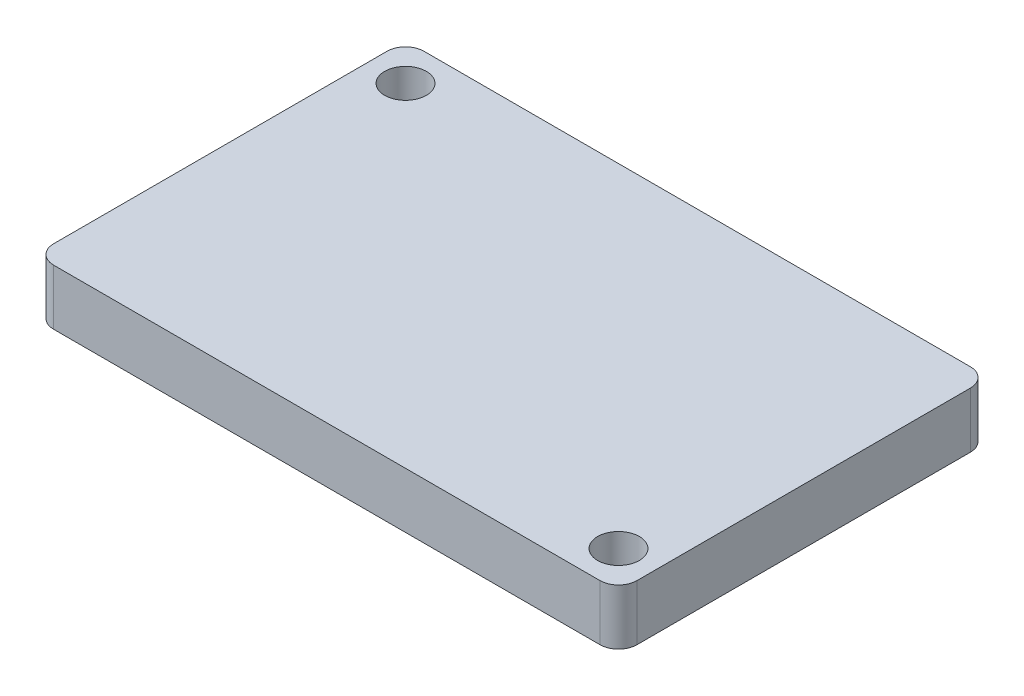
ISO-10303-21;
HEADER;
FILE_DESCRIPTION(('STEP AP214'),'2;1');
FILE_NAME('part.step','',(''),(''),'','','');
FILE_SCHEMA(('AUTOMOTIVE_DESIGN { 1 0 10303 214 1 1 1 1 }'));
ENDSEC;
DATA;
#1=APPLICATION_CONTEXT('core data for automotive mechanical design processes');
#2=APPLICATION_PROTOCOL_DEFINITION('international standard','automotive_design',2000,#1);
#3=PRODUCT_CONTEXT('',#1,'mechanical');
#4=PRODUCT('Part','Part','',(#3));
#5=PRODUCT_RELATED_PRODUCT_CATEGORY('part','',(#4));
#6=PRODUCT_DEFINITION_FORMATION('','',#4);
#7=PRODUCT_DEFINITION_CONTEXT('part definition',#1,'design');
#8=PRODUCT_DEFINITION('design','',#6,#7);
#9=PRODUCT_DEFINITION_SHAPE('','',#8);
#10=(LENGTH_UNIT() NAMED_UNIT(*) SI_UNIT(.MILLI.,.METRE.));
#11=(NAMED_UNIT(*) PLANE_ANGLE_UNIT() SI_UNIT($,.RADIAN.));
#12=(NAMED_UNIT(*) SI_UNIT($,.STERADIAN.) SOLID_ANGLE_UNIT());
#13=UNCERTAINTY_MEASURE_WITH_UNIT(LENGTH_MEASURE(1.E-05),#10,'distance_accuracy_value','');
#14=(GEOMETRIC_REPRESENTATION_CONTEXT(3) GLOBAL_UNCERTAINTY_ASSIGNED_CONTEXT((#13)) GLOBAL_UNIT_ASSIGNED_CONTEXT((#10,
#11,#12)) REPRESENTATION_CONTEXT('',''));
#15=CARTESIAN_POINT('',(0.,0.,0.));
#16=DIRECTION('',(0.,0.,1.));
#17=DIRECTION('',(1.,0.,0.));
#18=AXIS2_PLACEMENT_3D('',#15,#16,#17);
#19=CARTESIAN_POINT('',(0.,6.,40.));
#20=DIRECTION('',(1.,0.,0.));
#21=DIRECTION('',(0.,0.,-1.));
#22=AXIS2_PLACEMENT_3D('',#19,#20,#21);
#23=PLANE('',#22);
#24=DIRECTION('',(0.,0.,-1.));
#25=VECTOR('',#24,1.);
#26=CARTESIAN_POINT('',(0.,6.,40.));
#27=LINE('',#26,#25);
#28=CARTESIAN_POINT('',(0.,6.,38.));
#29=VERTEX_POINT('',#28);
#30=CARTESIAN_POINT('',(0.,6.,2.));
#31=VERTEX_POINT('',#30);
#32=EDGE_CURVE('E160',#29,#31,#27,.T.);
#33=ORIENTED_EDGE('',*,*,#32,.T.);
#34=DIRECTION('',(0.,-1.,0.));
#35=VECTOR('',#34,1.);
#36=CARTESIAN_POINT('',(0.,6.,2.));
#37=LINE('',#36,#35);
#38=CARTESIAN_POINT('',(0.,0.,2.));
#39=VERTEX_POINT('',#38);
#40=EDGE_CURVE('E124',#31,#39,#37,.T.);
#41=ORIENTED_EDGE('',*,*,#40,.T.);
#42=DIRECTION('',(0.,0.,-1.));
#43=VECTOR('',#42,1.);
#44=CARTESIAN_POINT('',(0.,0.,40.));
#45=LINE('',#44,#43);
#46=CARTESIAN_POINT('',(0.,0.,38.));
#47=VERTEX_POINT('',#46);
#48=EDGE_CURVE('E109',#47,#39,#45,.T.);
#49=ORIENTED_EDGE('',*,*,#48,.F.);
#50=DIRECTION('',(0.,-1.,0.));
#51=VECTOR('',#50,1.);
#52=CARTESIAN_POINT('',(0.,6.,38.));
#53=LINE('',#52,#51);
#54=EDGE_CURVE('E121',#47,#29,#53,.F.);
#55=ORIENTED_EDGE('',*,*,#54,.T.);
#56=EDGE_LOOP('',(#33,#41,#49,#55));
#57=FACE_BOUND('',#56,.T.);
#58=ADVANCED_FACE('F39',(#57),#23,.F.);
#59=CARTESIAN_POINT('',(0.,0.,40.));
#60=DIRECTION('',(0.,1.,0.));
#61=DIRECTION('',(0.,0.,1.));
#62=AXIS2_PLACEMENT_3D('',#59,#60,#61);
#63=PLANE('',#62);
#64=CARTESIAN_POINT('',(59.,0.,36.));
#65=DIRECTION('',(0.,1.,0.));
#66=DIRECTION('',(0.,0.,1.));
#67=AXIS2_PLACEMENT_3D('',#64,#65,#66);
#68=CIRCLE('',#67,2.25);
#69=CARTESIAN_POINT('',(59.,0.,38.25));
#70=VERTEX_POINT('',#69);
#71=EDGE_CURVE('E315',#70,#70,#68,.T.);
#72=ORIENTED_EDGE('',*,*,#71,.T.);
#73=EDGE_LOOP('',(#72));
#74=FACE_BOUND('',#73,.T.);
#75=CARTESIAN_POINT('',(4.,0.,4.));
#76=DIRECTION('',(0.,1.,0.));
#77=DIRECTION('',(0.,0.,1.));
#78=AXIS2_PLACEMENT_3D('',#75,#76,#77);
#79=CIRCLE('',#78,2.25);
#80=CARTESIAN_POINT('',(4.,0.,6.25));
#81=VERTEX_POINT('',#80);
#82=EDGE_CURVE('E171',#81,#81,#79,.T.);
#83=ORIENTED_EDGE('',*,*,#82,.T.);
#84=EDGE_LOOP('',(#83));
#85=FACE_BOUND('',#84,.T.);
#86=ORIENTED_EDGE('',*,*,#48,.T.);
#87=CARTESIAN_POINT('',(2.,0.,2.));
#88=DIRECTION('',(0.,1.,0.));
#89=DIRECTION('',(0.,0.,1.));
#90=AXIS2_PLACEMENT_3D('',#87,#88,#89);
#91=CIRCLE('',#90,2.);
#92=CARTESIAN_POINT('',(2.,0.,0.));
#93=VERTEX_POINT('',#92);
#94=EDGE_CURVE('E136',#39,#93,#91,.F.);
#95=ORIENTED_EDGE('',*,*,#94,.T.);
#96=DIRECTION('',(1.,0.,0.));
#97=VECTOR('',#96,1.);
#98=CARTESIAN_POINT('',(0.,0.,0.));
#99=LINE('',#98,#97);
#100=CARTESIAN_POINT('',(61.,0.,0.));
#101=VERTEX_POINT('',#100);
#102=EDGE_CURVE('E168',#93,#101,#99,.T.);
#103=ORIENTED_EDGE('',*,*,#102,.T.);
#104=CARTESIAN_POINT('',(61.,0.,2.));
#105=DIRECTION('',(0.,1.,0.));
#106=DIRECTION('',(0.,0.,1.));
#107=AXIS2_PLACEMENT_3D('',#104,#105,#106);
#108=CIRCLE('',#107,2.);
#109=CARTESIAN_POINT('',(63.,0.,2.));
#110=VERTEX_POINT('',#109);
#111=EDGE_CURVE('E115',#101,#110,#108,.F.);
#112=ORIENTED_EDGE('',*,*,#111,.T.);
#113=DIRECTION('',(0.,0.,-1.));
#114=VECTOR('',#113,1.);
#115=CARTESIAN_POINT('',(63.,0.,40.));
#116=LINE('',#115,#114);
#117=CARTESIAN_POINT('',(63.,0.,38.));
#118=VERTEX_POINT('',#117);
#119=EDGE_CURVE('E125',#118,#110,#116,.T.);
#120=ORIENTED_EDGE('',*,*,#119,.F.);
#121=CARTESIAN_POINT('',(61.,0.,38.));
#122=DIRECTION('',(0.,1.,0.));
#123=DIRECTION('',(0.,0.,1.));
#124=AXIS2_PLACEMENT_3D('',#121,#122,#123);
#125=CIRCLE('',#124,2.);
#126=CARTESIAN_POINT('',(61.,0.,40.));
#127=VERTEX_POINT('',#126);
#128=EDGE_CURVE('E116',#118,#127,#125,.F.);
#129=ORIENTED_EDGE('',*,*,#128,.T.);
#130=DIRECTION('',(1.,0.,0.));
#131=VECTOR('',#130,1.);
#132=CARTESIAN_POINT('',(0.,0.,40.));
#133=LINE('',#132,#131);
#134=CARTESIAN_POINT('',(2.,0.,40.));
#135=VERTEX_POINT('',#134);
#136=EDGE_CURVE('E111',#135,#127,#133,.T.);
#137=ORIENTED_EDGE('',*,*,#136,.F.);
#138=CARTESIAN_POINT('',(2.,0.,38.));
#139=DIRECTION('',(0.,1.,0.));
#140=DIRECTION('',(0.,0.,1.));
#141=AXIS2_PLACEMENT_3D('',#138,#139,#140);
#142=CIRCLE('',#141,2.);
#143=EDGE_CURVE('E106',#135,#47,#142,.F.);
#144=ORIENTED_EDGE('',*,*,#143,.T.);
#145=EDGE_LOOP('',(#86,#95,#103,#112,#120,#129,#137,#144));
#146=FACE_BOUND('',#145,.T.);
#147=ADVANCED_FACE('F108',(#74,#85,#146),#63,.F.);
#148=CARTESIAN_POINT('',(63.,0.,40.));
#149=DIRECTION('',(-1.,0.,0.));
#150=DIRECTION('',(0.,0.,1.));
#151=AXIS2_PLACEMENT_3D('',#148,#149,#150);
#152=PLANE('',#151);
#153=ORIENTED_EDGE('',*,*,#119,.T.);
#154=DIRECTION('',(0.,1.,0.));
#155=VECTOR('',#154,1.);
#156=CARTESIAN_POINT('',(63.,0.,2.));
#157=LINE('',#156,#155);
#158=CARTESIAN_POINT('',(63.,6.,2.));
#159=VERTEX_POINT('',#158);
#160=EDGE_CURVE('E149',#110,#159,#157,.T.);
#161=ORIENTED_EDGE('',*,*,#160,.T.);
#162=DIRECTION('',(0.,0.,-1.));
#163=VECTOR('',#162,1.);
#164=CARTESIAN_POINT('',(63.,6.,40.));
#165=LINE('',#164,#163);
#166=CARTESIAN_POINT('',(63.,6.,38.));
#167=VERTEX_POINT('',#166);
#168=EDGE_CURVE('E162',#167,#159,#165,.T.);
#169=ORIENTED_EDGE('',*,*,#168,.F.);
#170=DIRECTION('',(0.,1.,0.));
#171=VECTOR('',#170,1.);
#172=CARTESIAN_POINT('',(63.,0.,38.));
#173=LINE('',#172,#171);
#174=EDGE_CURVE('E147',#167,#118,#173,.F.);
#175=ORIENTED_EDGE('',*,*,#174,.T.);
#176=EDGE_LOOP('',(#153,#161,#169,#175));
#177=FACE_BOUND('',#176,.T.);
#178=ADVANCED_FACE('F176',(#177),#152,.F.);
#179=CARTESIAN_POINT('',(63.,6.,40.));
#180=DIRECTION('',(0.,-1.,0.));
#181=DIRECTION('',(0.,0.,-1.));
#182=AXIS2_PLACEMENT_3D('',#179,#180,#181);
#183=PLANE('',#182);
#184=CARTESIAN_POINT('',(59.,6.,36.));
#185=DIRECTION('',(0.,1.,0.));
#186=DIRECTION('',(0.,0.,1.));
#187=AXIS2_PLACEMENT_3D('',#184,#185,#186);
#188=CIRCLE('',#187,2.25);
#189=CARTESIAN_POINT('',(59.,6.,38.25));
#190=VERTEX_POINT('',#189);
#191=EDGE_CURVE('E318',#190,#190,#188,.T.);
#192=ORIENTED_EDGE('',*,*,#191,.F.);
#193=EDGE_LOOP('',(#192));
#194=FACE_BOUND('',#193,.T.);
#195=CARTESIAN_POINT('',(4.,6.,4.));
#196=DIRECTION('',(0.,1.,0.));
#197=DIRECTION('',(0.,0.,1.));
#198=AXIS2_PLACEMENT_3D('',#195,#196,#197);
#199=CIRCLE('',#198,2.25);
#200=CARTESIAN_POINT('',(4.,6.,6.25));
#201=VERTEX_POINT('',#200);
#202=EDGE_CURVE('E320',#201,#201,#199,.T.);
#203=ORIENTED_EDGE('',*,*,#202,.F.);
#204=EDGE_LOOP('',(#203));
#205=FACE_BOUND('',#204,.T.);
#206=DIRECTION('',(-1.,0.,0.));
#207=VECTOR('',#206,1.);
#208=CARTESIAN_POINT('',(63.,6.,0.));
#209=LINE('',#208,#207);
#210=CARTESIAN_POINT('',(61.,6.,0.));
#211=VERTEX_POINT('',#210);
#212=CARTESIAN_POINT('',(2.,6.,0.));
#213=VERTEX_POINT('',#212);
#214=EDGE_CURVE('E164',#211,#213,#209,.T.);
#215=ORIENTED_EDGE('',*,*,#214,.T.);
#216=CARTESIAN_POINT('',(2.,6.,2.));
#217=DIRECTION('',(0.,-1.,0.));
#218=DIRECTION('',(0.,0.,-1.));
#219=AXIS2_PLACEMENT_3D('',#216,#217,#218);
#220=CIRCLE('',#219,2.);
#221=EDGE_CURVE('E145',#213,#31,#220,.F.);
#222=ORIENTED_EDGE('',*,*,#221,.T.);
#223=ORIENTED_EDGE('',*,*,#32,.F.);
#224=CARTESIAN_POINT('',(2.,6.,38.));
#225=DIRECTION('',(0.,-1.,0.));
#226=DIRECTION('',(0.,0.,-1.));
#227=AXIS2_PLACEMENT_3D('',#224,#225,#226);
#228=CIRCLE('',#227,2.);
#229=CARTESIAN_POINT('',(2.,6.,40.));
#230=VERTEX_POINT('',#229);
#231=EDGE_CURVE('E129',#29,#230,#228,.F.);
#232=ORIENTED_EDGE('',*,*,#231,.T.);
#233=DIRECTION('',(-1.,0.,0.));
#234=VECTOR('',#233,1.);
#235=CARTESIAN_POINT('',(63.,6.,40.));
#236=LINE('',#235,#234);
#237=CARTESIAN_POINT('',(61.,6.,40.));
#238=VERTEX_POINT('',#237);
#239=EDGE_CURVE('E155',#238,#230,#236,.T.);
#240=ORIENTED_EDGE('',*,*,#239,.F.);
#241=CARTESIAN_POINT('',(61.,6.,38.));
#242=DIRECTION('',(0.,-1.,0.));
#243=DIRECTION('',(0.,0.,-1.));
#244=AXIS2_PLACEMENT_3D('',#241,#242,#243);
#245=CIRCLE('',#244,2.);
#246=EDGE_CURVE('E62',#238,#167,#245,.F.);
#247=ORIENTED_EDGE('',*,*,#246,.T.);
#248=ORIENTED_EDGE('',*,*,#168,.T.);
#249=CARTESIAN_POINT('',(61.,6.,2.));
#250=DIRECTION('',(0.,-1.,0.));
#251=DIRECTION('',(0.,0.,-1.));
#252=AXIS2_PLACEMENT_3D('',#249,#250,#251);
#253=CIRCLE('',#252,2.);
#254=EDGE_CURVE('E54',#159,#211,#253,.F.);
#255=ORIENTED_EDGE('',*,*,#254,.T.);
#256=EDGE_LOOP('',(#215,#222,#223,#232,#240,#247,#248,#255));
#257=FACE_BOUND('',#256,.T.);
#258=ADVANCED_FACE('F159',(#194,#205,#257),#183,.F.);
#259=CARTESIAN_POINT('',(0.,0.,40.));
#260=DIRECTION('',(0.,0.,1.));
#261=DIRECTION('',(1.,0.,0.));
#262=AXIS2_PLACEMENT_3D('',#259,#260,#261);
#263=PLANE('',#262);
#264=ORIENTED_EDGE('',*,*,#239,.T.);
#265=DIRECTION('',(0.,-1.,0.));
#266=VECTOR('',#265,1.);
#267=CARTESIAN_POINT('',(2.,0.,40.));
#268=LINE('',#267,#266);
#269=EDGE_CURVE('E11',#230,#135,#268,.T.);
#270=ORIENTED_EDGE('',*,*,#269,.T.);
#271=ORIENTED_EDGE('',*,*,#136,.T.);
#272=DIRECTION('',(0.,1.,0.));
#273=VECTOR('',#272,1.);
#274=CARTESIAN_POINT('',(61.,6.,40.));
#275=LINE('',#274,#273);
#276=EDGE_CURVE('E47',#127,#238,#275,.T.);
#277=ORIENTED_EDGE('',*,*,#276,.T.);
#278=EDGE_LOOP('',(#264,#270,#271,#277));
#279=FACE_BOUND('',#278,.T.);
#280=ADVANCED_FACE('F154',(#279),#263,.T.);
#281=CARTESIAN_POINT('',(0.,0.,0.));
#282=DIRECTION('',(0.,0.,1.));
#283=DIRECTION('',(1.,0.,0.));
#284=AXIS2_PLACEMENT_3D('',#281,#282,#283);
#285=PLANE('',#284);
#286=ORIENTED_EDGE('',*,*,#102,.F.);
#287=DIRECTION('',(0.,-1.,0.));
#288=VECTOR('',#287,1.);
#289=CARTESIAN_POINT('',(2.,0.,0.));
#290=LINE('',#289,#288);
#291=EDGE_CURVE('E140',#93,#213,#290,.F.);
#292=ORIENTED_EDGE('',*,*,#291,.T.);
#293=ORIENTED_EDGE('',*,*,#214,.F.);
#294=DIRECTION('',(0.,1.,0.));
#295=VECTOR('',#294,1.);
#296=CARTESIAN_POINT('',(61.,0.,0.));
#297=LINE('',#296,#295);
#298=EDGE_CURVE('E138',#211,#101,#297,.F.);
#299=ORIENTED_EDGE('',*,*,#298,.T.);
#300=EDGE_LOOP('',(#286,#292,#293,#299));
#301=FACE_BOUND('',#300,.T.);
#302=ADVANCED_FACE('F183',(#301),#285,.F.);
#303=CARTESIAN_POINT('',(2.,6.,2.));
#304=DIRECTION('',(0.,-1.,0.));
#305=DIRECTION('',(0.,0.,-1.));
#306=AXIS2_PLACEMENT_3D('',#303,#304,#305);
#307=CYLINDRICAL_SURFACE('',#306,2.);
#308=ORIENTED_EDGE('',*,*,#221,.F.);
#309=ORIENTED_EDGE('',*,*,#291,.F.);
#310=ORIENTED_EDGE('',*,*,#94,.F.);
#311=ORIENTED_EDGE('',*,*,#40,.F.);
#312=EDGE_LOOP('',(#308,#309,#310,#311));
#313=FACE_BOUND('',#312,.T.);
#314=ADVANCED_FACE('F187',(#313),#307,.T.);
#315=CARTESIAN_POINT('',(61.,0.,2.));
#316=DIRECTION('',(0.,1.,0.));
#317=DIRECTION('',(0.,0.,1.));
#318=AXIS2_PLACEMENT_3D('',#315,#316,#317);
#319=CYLINDRICAL_SURFACE('',#318,2.);
#320=ORIENTED_EDGE('',*,*,#111,.F.);
#321=ORIENTED_EDGE('',*,*,#298,.F.);
#322=ORIENTED_EDGE('',*,*,#254,.F.);
#323=ORIENTED_EDGE('',*,*,#160,.F.);
#324=EDGE_LOOP('',(#320,#321,#322,#323));
#325=FACE_BOUND('',#324,.T.);
#326=ADVANCED_FACE('F179',(#325),#319,.T.);
#327=CARTESIAN_POINT('',(2.,0.,38.));
#328=DIRECTION('',(0.,1.,0.));
#329=DIRECTION('',(0.,0.,1.));
#330=AXIS2_PLACEMENT_3D('',#327,#328,#329);
#331=CYLINDRICAL_SURFACE('',#330,2.);
#332=ORIENTED_EDGE('',*,*,#231,.F.);
#333=ORIENTED_EDGE('',*,*,#54,.F.);
#334=ORIENTED_EDGE('',*,*,#143,.F.);
#335=ORIENTED_EDGE('',*,*,#269,.F.);
#336=EDGE_LOOP('',(#332,#333,#334,#335));
#337=FACE_BOUND('',#336,.T.);
#338=ADVANCED_FACE('F128',(#337),#331,.T.);
#339=CARTESIAN_POINT('',(61.,0.,38.));
#340=DIRECTION('',(0.,-1.,0.));
#341=DIRECTION('',(0.,0.,-1.));
#342=AXIS2_PLACEMENT_3D('',#339,#340,#341);
#343=CYLINDRICAL_SURFACE('',#342,2.);
#344=ORIENTED_EDGE('',*,*,#128,.F.);
#345=ORIENTED_EDGE('',*,*,#174,.F.);
#346=ORIENTED_EDGE('',*,*,#246,.F.);
#347=ORIENTED_EDGE('',*,*,#276,.F.);
#348=EDGE_LOOP('',(#344,#345,#346,#347));
#349=FACE_BOUND('',#348,.T.);
#350=ADVANCED_FACE('F41',(#349),#343,.T.);
#351=CARTESIAN_POINT('',(4.,0.,4.));
#352=DIRECTION('',(0.,1.,0.));
#353=DIRECTION('',(0.,0.,1.));
#354=AXIS2_PLACEMENT_3D('',#351,#352,#353);
#355=CYLINDRICAL_SURFACE('',#354,2.25);
#356=ORIENTED_EDGE('',*,*,#82,.F.);
#357=EDGE_LOOP('',(#356));
#358=FACE_BOUND('',#357,.T.);
#359=ORIENTED_EDGE('',*,*,#202,.T.);
#360=EDGE_LOOP('',(#359));
#361=FACE_BOUND('',#360,.T.);
#362=ADVANCED_FACE('F189',(#358,#361),#355,.F.);
#363=CARTESIAN_POINT('',(59.,0.,36.));
#364=DIRECTION('',(0.,1.,0.));
#365=DIRECTION('',(0.,0.,1.));
#366=AXIS2_PLACEMENT_3D('',#363,#364,#365);
#367=CYLINDRICAL_SURFACE('',#366,2.25);
#368=ORIENTED_EDGE('',*,*,#71,.F.);
#369=EDGE_LOOP('',(#368));
#370=FACE_BOUND('',#369,.T.);
#371=ORIENTED_EDGE('',*,*,#191,.T.);
#372=EDGE_LOOP('',(#371));
#373=FACE_BOUND('',#372,.T.);
#374=ADVANCED_FACE('F194',(#370,#373),#367,.F.);
#375=CLOSED_SHELL('',(#58,#147,#178,#258,#280,#302,#314,#326,#338,#350,#362,#374));
#376=MANIFOLD_SOLID_BREP('B2',#375);
#377=ADVANCED_BREP_SHAPE_REPRESENTATION('',(#18,#376),#14);
#378=SHAPE_DEFINITION_REPRESENTATION(#9,#377);
ENDSEC;
END-ISO-10303-21;
